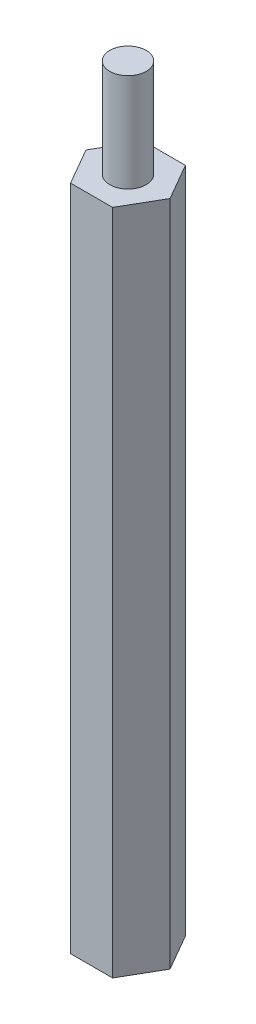
ISO-10303-21;
HEADER;
FILE_DESCRIPTION(('STEP AP214'),'2;1');
FILE_NAME('part.step','',(''),(''),'','','');
FILE_SCHEMA(('AUTOMOTIVE_DESIGN { 1 0 10303 214 1 1 1 1 }'));
ENDSEC;
DATA;
#1=APPLICATION_CONTEXT('core data for automotive mechanical design processes');
#2=APPLICATION_PROTOCOL_DEFINITION('international standard','automotive_design',2000,#1);
#3=PRODUCT_CONTEXT('',#1,'mechanical');
#4=PRODUCT('Part','Part','',(#3));
#5=PRODUCT_RELATED_PRODUCT_CATEGORY('part','',(#4));
#6=PRODUCT_DEFINITION_FORMATION('','',#4);
#7=PRODUCT_DEFINITION_CONTEXT('part definition',#1,'design');
#8=PRODUCT_DEFINITION('design','',#6,#7);
#9=PRODUCT_DEFINITION_SHAPE('','',#8);
#10=(LENGTH_UNIT() NAMED_UNIT(*) SI_UNIT(.MILLI.,.METRE.));
#11=(NAMED_UNIT(*) PLANE_ANGLE_UNIT() SI_UNIT($,.RADIAN.));
#12=(NAMED_UNIT(*) SI_UNIT($,.STERADIAN.) SOLID_ANGLE_UNIT());
#13=UNCERTAINTY_MEASURE_WITH_UNIT(LENGTH_MEASURE(1.E-05),#10,'distance_accuracy_value','');
#14=(GEOMETRIC_REPRESENTATION_CONTEXT(3) GLOBAL_UNCERTAINTY_ASSIGNED_CONTEXT((#13)) GLOBAL_UNIT_ASSIGNED_CONTEXT((#10,
#11,#12)) REPRESENTATION_CONTEXT('',''));
#15=CARTESIAN_POINT('',(0.,0.,0.));
#16=DIRECTION('',(0.,0.,1.));
#17=DIRECTION('',(1.,0.,0.));
#18=AXIS2_PLACEMENT_3D('',#15,#16,#17);
#19=CARTESIAN_POINT('',(-1.73205080756888,55.,-3.));
#20=DIRECTION('',(0.866025403784439,0.,0.5));
#21=DIRECTION('',(0.5,0.,-0.866025403784438));
#22=AXIS2_PLACEMENT_3D('',#19,#20,#21);
#23=PLANE('',#22);
#24=DIRECTION('',(-0.5,0.,0.866025403784439));
#25=VECTOR('',#24,1.);
#26=CARTESIAN_POINT('',(-1.73205080756888,0.,-3.));
#27=LINE('',#26,#25);
#28=CARTESIAN_POINT('',(-1.73205080756888,0.,-3.));
#29=VERTEX_POINT('',#28);
#30=CARTESIAN_POINT('',(-3.46410161513775,0.,0.));
#31=VERTEX_POINT('',#30);
#32=EDGE_CURVE('E123',#29,#31,#27,.T.);
#33=ORIENTED_EDGE('',*,*,#32,.T.);
#34=DIRECTION('',(0.,-1.,0.));
#35=VECTOR('',#34,1.);
#36=CARTESIAN_POINT('',(-3.46410161513775,55.,0.));
#37=LINE('',#36,#35);
#38=CARTESIAN_POINT('',(-3.46410161513775,55.,0.));
#39=VERTEX_POINT('',#38);
#40=EDGE_CURVE('E40',#39,#31,#37,.T.);
#41=ORIENTED_EDGE('',*,*,#40,.F.);
#42=DIRECTION('',(-0.5,0.,0.866025403784439));
#43=VECTOR('',#42,1.);
#44=CARTESIAN_POINT('',(-1.73205080756888,55.,-3.));
#45=LINE('',#44,#43);
#46=CARTESIAN_POINT('',(-1.73205080756888,55.,-3.));
#47=VERTEX_POINT('',#46);
#48=EDGE_CURVE('E134',#47,#39,#45,.T.);
#49=ORIENTED_EDGE('',*,*,#48,.F.);
#50=DIRECTION('',(0.,-1.,0.));
#51=VECTOR('',#50,1.);
#52=CARTESIAN_POINT('',(-1.73205080756888,55.,-3.));
#53=LINE('',#52,#51);
#54=EDGE_CURVE('E119',#47,#29,#53,.T.);
#55=ORIENTED_EDGE('',*,*,#54,.T.);
#56=EDGE_LOOP('',(#33,#41,#49,#55));
#57=FACE_BOUND('',#56,.T.);
#58=ADVANCED_FACE('F37',(#57),#23,.F.);
#59=CARTESIAN_POINT('',(-3.46410161513775,55.,0.));
#60=DIRECTION('',(0.866025403784439,0.,-0.5));
#61=DIRECTION('',(-0.5,0.,-0.866025403784439));
#62=AXIS2_PLACEMENT_3D('',#59,#60,#61);
#63=PLANE('',#62);
#64=DIRECTION('',(0.5,0.,0.866025403784439));
#65=VECTOR('',#64,1.);
#66=CARTESIAN_POINT('',(-3.46410161513775,0.,0.));
#67=LINE('',#66,#65);
#68=CARTESIAN_POINT('',(-1.73205080756888,0.,3.));
#69=VERTEX_POINT('',#68);
#70=EDGE_CURVE('E126',#31,#69,#67,.T.);
#71=ORIENTED_EDGE('',*,*,#70,.T.);
#72=DIRECTION('',(0.,-1.,0.));
#73=VECTOR('',#72,1.);
#74=CARTESIAN_POINT('',(-1.73205080756888,55.,3.));
#75=LINE('',#74,#73);
#76=CARTESIAN_POINT('',(-1.73205080756888,55.,3.));
#77=VERTEX_POINT('',#76);
#78=EDGE_CURVE('E137',#77,#69,#75,.T.);
#79=ORIENTED_EDGE('',*,*,#78,.F.);
#80=DIRECTION('',(0.5,0.,0.866025403784439));
#81=VECTOR('',#80,1.);
#82=CARTESIAN_POINT('',(-3.46410161513775,55.,0.));
#83=LINE('',#82,#81);
#84=EDGE_CURVE('E92',#39,#77,#83,.T.);
#85=ORIENTED_EDGE('',*,*,#84,.F.);
#86=ORIENTED_EDGE('',*,*,#40,.T.);
#87=EDGE_LOOP('',(#71,#79,#85,#86));
#88=FACE_BOUND('',#87,.T.);
#89=ADVANCED_FACE('F142',(#88),#63,.F.);
#90=CARTESIAN_POINT('',(-1.73205080756888,55.,3.));
#91=DIRECTION('',(0.,0.,-1.));
#92=DIRECTION('',(-1.,0.,0.));
#93=AXIS2_PLACEMENT_3D('',#90,#91,#92);
#94=PLANE('',#93);
#95=DIRECTION('',(1.,0.,0.));
#96=VECTOR('',#95,1.);
#97=CARTESIAN_POINT('',(-1.73205080756888,0.,3.));
#98=LINE('',#97,#96);
#99=CARTESIAN_POINT('',(1.73205080756888,0.,3.));
#100=VERTEX_POINT('',#99);
#101=EDGE_CURVE('E129',#69,#100,#98,.T.);
#102=ORIENTED_EDGE('',*,*,#101,.T.);
#103=DIRECTION('',(0.,-1.,0.));
#104=VECTOR('',#103,1.);
#105=CARTESIAN_POINT('',(1.73205080756888,55.,3.));
#106=LINE('',#105,#104);
#107=CARTESIAN_POINT('',(1.73205080756888,55.,3.));
#108=VERTEX_POINT('',#107);
#109=EDGE_CURVE('E114',#108,#100,#106,.T.);
#110=ORIENTED_EDGE('',*,*,#109,.F.);
#111=DIRECTION('',(1.,0.,0.));
#112=VECTOR('',#111,1.);
#113=CARTESIAN_POINT('',(-1.73205080756888,55.,3.));
#114=LINE('',#113,#112);
#115=EDGE_CURVE('E105',#77,#108,#114,.T.);
#116=ORIENTED_EDGE('',*,*,#115,.F.);
#117=ORIENTED_EDGE('',*,*,#78,.T.);
#118=EDGE_LOOP('',(#102,#110,#116,#117));
#119=FACE_BOUND('',#118,.T.);
#120=ADVANCED_FACE('F148',(#119),#94,.F.);
#121=CARTESIAN_POINT('',(1.73205080756888,55.,3.));
#122=DIRECTION('',(-0.866025403784439,0.,-0.5));
#123=DIRECTION('',(-0.5,0.,0.866025403784439));
#124=AXIS2_PLACEMENT_3D('',#121,#122,#123);
#125=PLANE('',#124);
#126=DIRECTION('',(0.5,0.,-0.866025403784439));
#127=VECTOR('',#126,1.);
#128=CARTESIAN_POINT('',(1.73205080756888,0.,3.));
#129=LINE('',#128,#127);
#130=CARTESIAN_POINT('',(3.46410161513775,0.,0.));
#131=VERTEX_POINT('',#130);
#132=EDGE_CURVE('E113',#100,#131,#129,.T.);
#133=ORIENTED_EDGE('',*,*,#132,.T.);
#134=DIRECTION('',(0.,-1.,0.));
#135=VECTOR('',#134,1.);
#136=CARTESIAN_POINT('',(3.46410161513775,55.,0.));
#137=LINE('',#136,#135);
#138=CARTESIAN_POINT('',(3.46410161513775,55.,0.));
#139=VERTEX_POINT('',#138);
#140=EDGE_CURVE('E110',#139,#131,#137,.T.);
#141=ORIENTED_EDGE('',*,*,#140,.F.);
#142=DIRECTION('',(0.5,0.,-0.866025403784439));
#143=VECTOR('',#142,1.);
#144=CARTESIAN_POINT('',(1.73205080756888,55.,3.));
#145=LINE('',#144,#143);
#146=EDGE_CURVE('E99',#108,#139,#145,.T.);
#147=ORIENTED_EDGE('',*,*,#146,.F.);
#148=ORIENTED_EDGE('',*,*,#109,.T.);
#149=EDGE_LOOP('',(#133,#141,#147,#148));
#150=FACE_BOUND('',#149,.T.);
#151=ADVANCED_FACE('F111',(#150),#125,.F.);
#152=CARTESIAN_POINT('',(3.46410161513775,55.,0.));
#153=DIRECTION('',(-0.866025403784439,0.,0.5));
#154=DIRECTION('',(0.5,0.,0.866025403784439));
#155=AXIS2_PLACEMENT_3D('',#152,#153,#154);
#156=PLANE('',#155);
#157=DIRECTION('',(-0.5,0.,-0.866025403784439));
#158=VECTOR('',#157,1.);
#159=CARTESIAN_POINT('',(3.46410161513775,0.,0.));
#160=LINE('',#159,#158);
#161=CARTESIAN_POINT('',(1.73205080756888,0.,-3.));
#162=VERTEX_POINT('',#161);
#163=EDGE_CURVE('E77',#131,#162,#160,.T.);
#164=ORIENTED_EDGE('',*,*,#163,.T.);
#165=DIRECTION('',(0.,-1.,0.));
#166=VECTOR('',#165,1.);
#167=CARTESIAN_POINT('',(1.73205080756888,55.,-3.));
#168=LINE('',#167,#166);
#169=CARTESIAN_POINT('',(1.73205080756888,55.,-3.));
#170=VERTEX_POINT('',#169);
#171=EDGE_CURVE('E115',#170,#162,#168,.T.);
#172=ORIENTED_EDGE('',*,*,#171,.F.);
#173=DIRECTION('',(-0.5,0.,-0.866025403784439));
#174=VECTOR('',#173,1.);
#175=CARTESIAN_POINT('',(3.46410161513775,55.,0.));
#176=LINE('',#175,#174);
#177=EDGE_CURVE('E103',#139,#170,#176,.T.);
#178=ORIENTED_EDGE('',*,*,#177,.F.);
#179=ORIENTED_EDGE('',*,*,#140,.T.);
#180=EDGE_LOOP('',(#164,#172,#178,#179));
#181=FACE_BOUND('',#180,.T.);
#182=ADVANCED_FACE('F117',(#181),#156,.F.);
#183=CARTESIAN_POINT('',(1.73205080756888,55.,-3.));
#184=DIRECTION('',(0.,0.,1.));
#185=DIRECTION('',(1.,0.,0.));
#186=AXIS2_PLACEMENT_3D('',#183,#184,#185);
#187=PLANE('',#186);
#188=DIRECTION('',(-1.,0.,0.));
#189=VECTOR('',#188,1.);
#190=CARTESIAN_POINT('',(1.73205080756888,0.,-3.));
#191=LINE('',#190,#189);
#192=EDGE_CURVE('E83',#162,#29,#191,.T.);
#193=ORIENTED_EDGE('',*,*,#192,.T.);
#194=ORIENTED_EDGE('',*,*,#54,.F.);
#195=DIRECTION('',(-1.,0.,0.));
#196=VECTOR('',#195,1.);
#197=CARTESIAN_POINT('',(1.73205080756888,55.,-3.));
#198=LINE('',#197,#196);
#199=EDGE_CURVE('E54',#170,#47,#198,.T.);
#200=ORIENTED_EDGE('',*,*,#199,.F.);
#201=ORIENTED_EDGE('',*,*,#171,.T.);
#202=EDGE_LOOP('',(#193,#194,#200,#201));
#203=FACE_BOUND('',#202,.T.);
#204=ADVANCED_FACE('F179',(#203),#187,.F.);
#205=CARTESIAN_POINT('',(0.,55.,0.));
#206=DIRECTION('',(0.,1.,0.));
#207=DIRECTION('',(0.,0.,1.));
#208=AXIS2_PLACEMENT_3D('',#205,#206,#207);
#209=PLANE('',#208);
#210=CARTESIAN_POINT('',(0.,55.,0.));
#211=DIRECTION('',(0.,1.,0.));
#212=DIRECTION('',(0.,0.,1.));
#213=AXIS2_PLACEMENT_3D('',#210,#211,#212);
#214=CIRCLE('',#213,1.5);
#215=CARTESIAN_POINT('',(0.,55.,1.5));
#216=VERTEX_POINT('',#215);
#217=EDGE_CURVE('E11',#216,#216,#214,.T.);
#218=ORIENTED_EDGE('',*,*,#217,.F.);
#219=EDGE_LOOP('',(#218));
#220=FACE_BOUND('',#219,.T.);
#221=ORIENTED_EDGE('',*,*,#48,.T.);
#222=ORIENTED_EDGE('',*,*,#84,.T.);
#223=ORIENTED_EDGE('',*,*,#115,.T.);
#224=ORIENTED_EDGE('',*,*,#146,.T.);
#225=ORIENTED_EDGE('',*,*,#177,.T.);
#226=ORIENTED_EDGE('',*,*,#199,.T.);
#227=EDGE_LOOP('',(#221,#222,#223,#224,#225,#226));
#228=FACE_BOUND('',#227,.T.);
#229=ADVANCED_FACE('F101',(#220,#228),#209,.T.);
#230=CARTESIAN_POINT('',(0.,0.,0.));
#231=DIRECTION('',(0.,1.,0.));
#232=DIRECTION('',(0.,0.,1.));
#233=AXIS2_PLACEMENT_3D('',#230,#231,#232);
#234=PLANE('',#233);
#235=CARTESIAN_POINT('',(0.,0.,0.));
#236=DIRECTION('',(0.,-1.,0.));
#237=DIRECTION('',(0.,0.,-1.));
#238=AXIS2_PLACEMENT_3D('',#235,#236,#237);
#239=CIRCLE('',#238,1.5);
#240=CARTESIAN_POINT('',(0.,0.,-1.5));
#241=VERTEX_POINT('',#240);
#242=EDGE_CURVE('E155',#241,#241,#239,.T.);
#243=ORIENTED_EDGE('',*,*,#242,.F.);
#244=EDGE_LOOP('',(#243));
#245=FACE_BOUND('',#244,.T.);
#246=ORIENTED_EDGE('',*,*,#32,.F.);
#247=ORIENTED_EDGE('',*,*,#192,.F.);
#248=ORIENTED_EDGE('',*,*,#163,.F.);
#249=ORIENTED_EDGE('',*,*,#132,.F.);
#250=ORIENTED_EDGE('',*,*,#101,.F.);
#251=ORIENTED_EDGE('',*,*,#70,.F.);
#252=EDGE_LOOP('',(#246,#247,#248,#249,#250,#251));
#253=FACE_BOUND('',#252,.T.);
#254=ADVANCED_FACE('F147',(#245,#253),#234,.F.);
#255=CARTESIAN_POINT('',(0.,63.0916054709663,0.));
#256=DIRECTION('',(0.,-1.,0.));
#257=DIRECTION('',(0.,0.,-1.));
#258=AXIS2_PLACEMENT_3D('',#255,#256,#257);
#259=CYLINDRICAL_SURFACE('',#258,1.5);
#260=CARTESIAN_POINT('',(0.,63.0916054709663,0.));
#261=DIRECTION('',(0.,1.,0.));
#262=DIRECTION('',(0.,0.,1.));
#263=AXIS2_PLACEMENT_3D('',#260,#261,#262);
#264=CIRCLE('',#263,1.5);
#265=CARTESIAN_POINT('',(0.,63.0916054709663,1.5));
#266=VERTEX_POINT('',#265);
#267=EDGE_CURVE('E127',#266,#266,#264,.T.);
#268=ORIENTED_EDGE('',*,*,#267,.F.);
#269=EDGE_LOOP('',(#268));
#270=FACE_BOUND('',#269,.T.);
#271=ORIENTED_EDGE('',*,*,#217,.T.);
#272=EDGE_LOOP('',(#271));
#273=FACE_BOUND('',#272,.T.);
#274=ADVANCED_FACE('F171',(#270,#273),#259,.T.);
#275=CARTESIAN_POINT('',(0.,63.0916054709663,0.));
#276=DIRECTION('',(0.,1.,0.));
#277=DIRECTION('',(0.,0.,1.));
#278=AXIS2_PLACEMENT_3D('',#275,#276,#277);
#279=PLANE('',#278);
#280=ORIENTED_EDGE('',*,*,#267,.T.);
#281=EDGE_LOOP('',(#280));
#282=FACE_BOUND('',#281,.T.);
#283=ADVANCED_FACE('F166',(#282),#279,.T.);
#284=CARTESIAN_POINT('',(0.,4.,0.));
#285=DIRECTION('',(0.,-1.,0.));
#286=DIRECTION('',(0.,0.,-1.));
#287=AXIS2_PLACEMENT_3D('',#284,#285,#286);
#288=CYLINDRICAL_SURFACE('',#287,1.5);
#289=CARTESIAN_POINT('',(0.,4.,0.));
#290=DIRECTION('',(0.,-1.,0.));
#291=DIRECTION('',(0.,0.,-1.));
#292=AXIS2_PLACEMENT_3D('',#289,#290,#291);
#293=CIRCLE('',#292,1.5);
#294=CARTESIAN_POINT('',(0.,4.,-1.5));
#295=VERTEX_POINT('',#294);
#296=EDGE_CURVE('E154',#295,#295,#293,.T.);
#297=ORIENTED_EDGE('',*,*,#296,.F.);
#298=EDGE_LOOP('',(#297));
#299=FACE_BOUND('',#298,.T.);
#300=ORIENTED_EDGE('',*,*,#242,.T.);
#301=EDGE_LOOP('',(#300));
#302=FACE_BOUND('',#301,.T.);
#303=ADVANCED_FACE('F163',(#299,#302),#288,.F.);
#304=CARTESIAN_POINT('',(0.,4.,0.));
#305=DIRECTION('',(0.,-1.,0.));
#306=DIRECTION('',(0.,0.,-1.));
#307=AXIS2_PLACEMENT_3D('',#304,#305,#306);
#308=PLANE('',#307);
#309=ORIENTED_EDGE('',*,*,#296,.T.);
#310=EDGE_LOOP('',(#309));
#311=FACE_BOUND('',#310,.T.);
#312=ADVANCED_FACE('F161',(#311),#308,.T.);
#313=CLOSED_SHELL('',(#58,#89,#120,#151,#182,#204,#229,#254,#274,#283,#303,#312));
#314=MANIFOLD_SOLID_BREP('B2',#313);
#315=ADVANCED_BREP_SHAPE_REPRESENTATION('',(#18,#314),#14);
#316=SHAPE_DEFINITION_REPRESENTATION(#9,#315);
ENDSEC;
END-ISO-10303-21;
